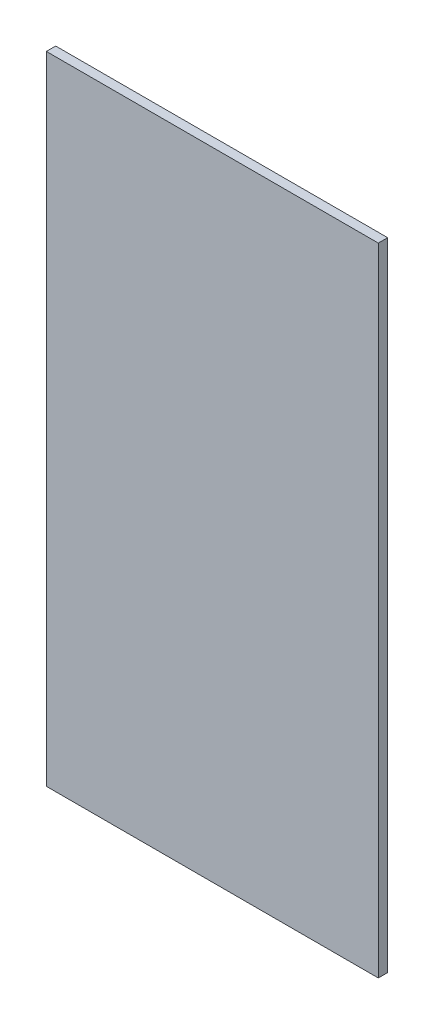
ISO-10303-21;
HEADER;
FILE_DESCRIPTION(('STEP AP214'),'2;1');
FILE_NAME('part.step','',(''),(''),'','','');
FILE_SCHEMA(('AUTOMOTIVE_DESIGN { 1 0 10303 214 1 1 1 1 }'));
ENDSEC;
DATA;
#1=APPLICATION_CONTEXT('core data for automotive mechanical design processes');
#2=APPLICATION_PROTOCOL_DEFINITION('international standard','automotive_design',2000,#1);
#3=PRODUCT_CONTEXT('',#1,'mechanical');
#4=PRODUCT('Part','Part','',(#3));
#5=PRODUCT_RELATED_PRODUCT_CATEGORY('part','',(#4));
#6=PRODUCT_DEFINITION_FORMATION('','',#4);
#7=PRODUCT_DEFINITION_CONTEXT('part definition',#1,'design');
#8=PRODUCT_DEFINITION('design','',#6,#7);
#9=PRODUCT_DEFINITION_SHAPE('','',#8);
#10=(LENGTH_UNIT() NAMED_UNIT(*) SI_UNIT(.MILLI.,.METRE.));
#11=(NAMED_UNIT(*) PLANE_ANGLE_UNIT() SI_UNIT($,.RADIAN.));
#12=(NAMED_UNIT(*) SI_UNIT($,.STERADIAN.) SOLID_ANGLE_UNIT());
#13=UNCERTAINTY_MEASURE_WITH_UNIT(LENGTH_MEASURE(1.E-05),#10,'distance_accuracy_value','');
#14=(GEOMETRIC_REPRESENTATION_CONTEXT(3) GLOBAL_UNCERTAINTY_ASSIGNED_CONTEXT((#13)) GLOBAL_UNIT_ASSIGNED_CONTEXT((#10,
#11,#12)) REPRESENTATION_CONTEXT('',''));
#15=CARTESIAN_POINT('',(0.,0.,0.));
#16=DIRECTION('',(0.,0.,1.));
#17=DIRECTION('',(1.,0.,0.));
#18=AXIS2_PLACEMENT_3D('',#15,#16,#17);
#19=CARTESIAN_POINT('',(-177.35,-340.,10.));
#20=DIRECTION('',(1.,0.,0.));
#21=DIRECTION('',(0.,0.,-1.));
#22=AXIS2_PLACEMENT_3D('',#19,#20,#21);
#23=PLANE('',#22);
#24=DIRECTION('',(0.,-1.,0.));
#25=VECTOR('',#24,1.);
#26=CARTESIAN_POINT('',(-177.35,-340.,0.));
#27=LINE('',#26,#25);
#28=CARTESIAN_POINT('',(-177.35,340.,0.));
#29=VERTEX_POINT('',#28);
#30=CARTESIAN_POINT('',(-177.35,-340.,0.));
#31=VERTEX_POINT('',#30);
#32=EDGE_CURVE('E102',#29,#31,#27,.T.);
#33=ORIENTED_EDGE('',*,*,#32,.T.);
#34=DIRECTION('',(0.,0.,-1.));
#35=VECTOR('',#34,1.);
#36=CARTESIAN_POINT('',(-177.35,-340.,10.));
#37=LINE('',#36,#35);
#38=CARTESIAN_POINT('',(-177.35,-340.,10.));
#39=VERTEX_POINT('',#38);
#40=EDGE_CURVE('E11',#39,#31,#37,.T.);
#41=ORIENTED_EDGE('',*,*,#40,.F.);
#42=DIRECTION('',(0.,-1.,0.));
#43=VECTOR('',#42,1.);
#44=CARTESIAN_POINT('',(-177.35,-340.,10.));
#45=LINE('',#44,#43);
#46=CARTESIAN_POINT('',(-177.35,340.,10.));
#47=VERTEX_POINT('',#46);
#48=EDGE_CURVE('E87',#47,#39,#45,.T.);
#49=ORIENTED_EDGE('',*,*,#48,.F.);
#50=DIRECTION('',(0.,0.,-1.));
#51=VECTOR('',#50,1.);
#52=CARTESIAN_POINT('',(-177.35,340.,10.));
#53=LINE('',#52,#51);
#54=EDGE_CURVE('E100',#47,#29,#53,.T.);
#55=ORIENTED_EDGE('',*,*,#54,.T.);
#56=EDGE_LOOP('',(#33,#41,#49,#55));
#57=FACE_BOUND('',#56,.T.);
#58=ADVANCED_FACE('F36',(#57),#23,.F.);
#59=CARTESIAN_POINT('',(177.35,-340.,10.));
#60=DIRECTION('',(0.,1.,0.));
#61=DIRECTION('',(0.,0.,1.));
#62=AXIS2_PLACEMENT_3D('',#59,#60,#61);
#63=PLANE('',#62);
#64=DIRECTION('',(1.,0.,0.));
#65=VECTOR('',#64,1.);
#66=CARTESIAN_POINT('',(177.35,-340.,0.));
#67=LINE('',#66,#65);
#68=CARTESIAN_POINT('',(177.35,-340.,0.));
#69=VERTEX_POINT('',#68);
#70=EDGE_CURVE('E93',#31,#69,#67,.T.);
#71=ORIENTED_EDGE('',*,*,#70,.T.);
#72=DIRECTION('',(0.,0.,-1.));
#73=VECTOR('',#72,1.);
#74=CARTESIAN_POINT('',(177.35,-340.,10.));
#75=LINE('',#74,#73);
#76=CARTESIAN_POINT('',(177.35,-340.,10.));
#77=VERTEX_POINT('',#76);
#78=EDGE_CURVE('E46',#77,#69,#75,.T.);
#79=ORIENTED_EDGE('',*,*,#78,.F.);
#80=DIRECTION('',(1.,0.,0.));
#81=VECTOR('',#80,1.);
#82=CARTESIAN_POINT('',(177.35,-340.,10.));
#83=LINE('',#82,#81);
#84=EDGE_CURVE('E84',#39,#77,#83,.T.);
#85=ORIENTED_EDGE('',*,*,#84,.F.);
#86=ORIENTED_EDGE('',*,*,#40,.T.);
#87=EDGE_LOOP('',(#71,#79,#85,#86));
#88=FACE_BOUND('',#87,.T.);
#89=ADVANCED_FACE('F95',(#88),#63,.F.);
#90=CARTESIAN_POINT('',(177.35,-340.,10.));
#91=DIRECTION('',(-1.,0.,0.));
#92=DIRECTION('',(0.,0.,1.));
#93=AXIS2_PLACEMENT_3D('',#90,#91,#92);
#94=PLANE('',#93);
#95=DIRECTION('',(0.,1.,0.));
#96=VECTOR('',#95,1.);
#97=CARTESIAN_POINT('',(177.35,-340.,0.));
#98=LINE('',#97,#96);
#99=CARTESIAN_POINT('',(177.35,340.,0.));
#100=VERTEX_POINT('',#99);
#101=EDGE_CURVE('E73',#69,#100,#98,.T.);
#102=ORIENTED_EDGE('',*,*,#101,.T.);
#103=DIRECTION('',(0.,0.,-1.));
#104=VECTOR('',#103,1.);
#105=CARTESIAN_POINT('',(177.35,340.,10.));
#106=LINE('',#105,#104);
#107=CARTESIAN_POINT('',(177.35,340.,10.));
#108=VERTEX_POINT('',#107);
#109=EDGE_CURVE('E92',#108,#100,#106,.T.);
#110=ORIENTED_EDGE('',*,*,#109,.F.);
#111=DIRECTION('',(0.,1.,0.));
#112=VECTOR('',#111,1.);
#113=CARTESIAN_POINT('',(177.35,-340.,10.));
#114=LINE('',#113,#112);
#115=EDGE_CURVE('E90',#77,#108,#114,.T.);
#116=ORIENTED_EDGE('',*,*,#115,.F.);
#117=ORIENTED_EDGE('',*,*,#78,.T.);
#118=EDGE_LOOP('',(#102,#110,#116,#117));
#119=FACE_BOUND('',#118,.T.);
#120=ADVANCED_FACE('F94',(#119),#94,.F.);
#121=CARTESIAN_POINT('',(177.35,340.,10.));
#122=DIRECTION('',(0.,-1.,0.));
#123=DIRECTION('',(1.,0.,0.));
#124=AXIS2_PLACEMENT_3D('',#121,#122,#123);
#125=PLANE('',#124);
#126=DIRECTION('',(-1.,0.,0.));
#127=VECTOR('',#126,1.);
#128=CARTESIAN_POINT('',(177.35,340.,0.));
#129=LINE('',#128,#127);
#130=EDGE_CURVE('E77',#100,#29,#129,.T.);
#131=ORIENTED_EDGE('',*,*,#130,.T.);
#132=ORIENTED_EDGE('',*,*,#54,.F.);
#133=DIRECTION('',(-1.,0.,0.));
#134=VECTOR('',#133,1.);
#135=CARTESIAN_POINT('',(177.35,340.,10.));
#136=LINE('',#135,#134);
#137=EDGE_CURVE('E53',#108,#47,#136,.T.);
#138=ORIENTED_EDGE('',*,*,#137,.F.);
#139=ORIENTED_EDGE('',*,*,#109,.T.);
#140=EDGE_LOOP('',(#131,#132,#138,#139));
#141=FACE_BOUND('',#140,.T.);
#142=ADVANCED_FACE('F108',(#141),#125,.F.);
#143=CARTESIAN_POINT('',(0.,0.,10.));
#144=DIRECTION('',(0.,0.,1.));
#145=DIRECTION('',(1.,0.,0.));
#146=AXIS2_PLACEMENT_3D('',#143,#144,#145);
#147=PLANE('',#146);
#148=ORIENTED_EDGE('',*,*,#48,.T.);
#149=ORIENTED_EDGE('',*,*,#84,.T.);
#150=ORIENTED_EDGE('',*,*,#115,.T.);
#151=ORIENTED_EDGE('',*,*,#137,.T.);
#152=EDGE_LOOP('',(#148,#149,#150,#151));
#153=FACE_BOUND('',#152,.T.);
#154=ADVANCED_FACE('F82',(#153),#147,.T.);
#155=CARTESIAN_POINT('',(0.,0.,0.));
#156=DIRECTION('',(0.,0.,1.));
#157=DIRECTION('',(1.,0.,0.));
#158=AXIS2_PLACEMENT_3D('',#155,#156,#157);
#159=PLANE('',#158);
#160=ORIENTED_EDGE('',*,*,#32,.F.);
#161=ORIENTED_EDGE('',*,*,#130,.F.);
#162=ORIENTED_EDGE('',*,*,#101,.F.);
#163=ORIENTED_EDGE('',*,*,#70,.F.);
#164=EDGE_LOOP('',(#160,#161,#162,#163));
#165=FACE_BOUND('',#164,.T.);
#166=ADVANCED_FACE('F112',(#165),#159,.F.);
#167=CLOSED_SHELL('',(#58,#89,#120,#142,#154,#166));
#168=MANIFOLD_SOLID_BREP('B2',#167);
#169=ADVANCED_BREP_SHAPE_REPRESENTATION('',(#18,#168),#14);
#170=SHAPE_DEFINITION_REPRESENTATION(#9,#169);
ENDSEC;
END-ISO-10303-21;
